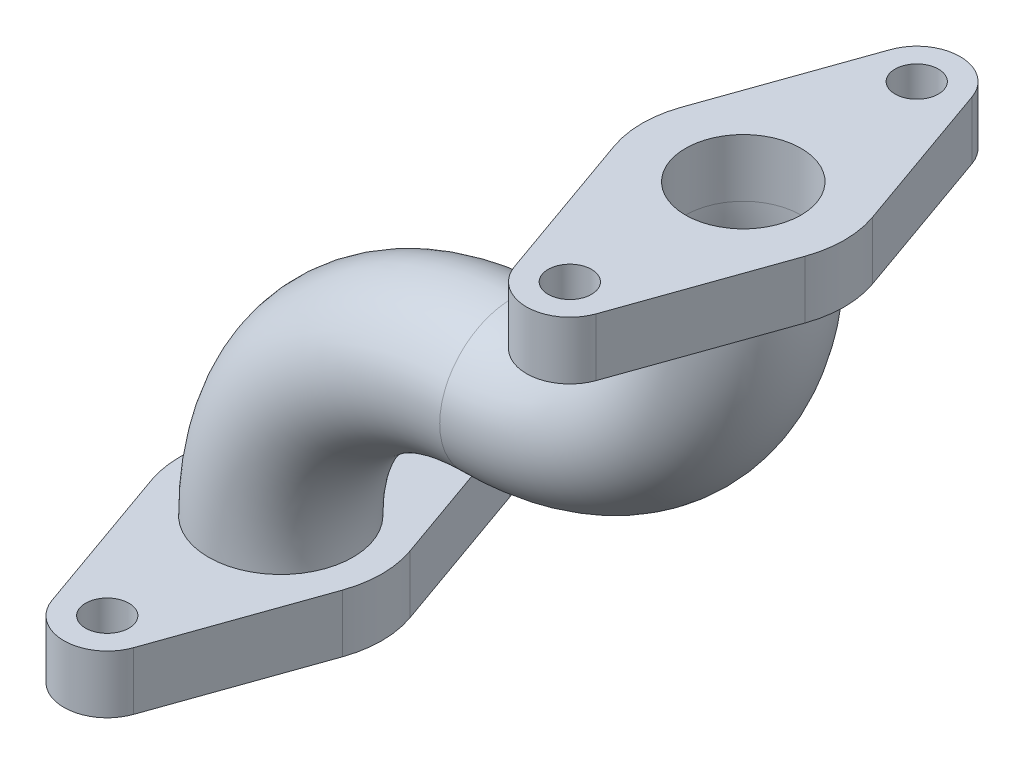
ISO-10303-21;
HEADER;
FILE_DESCRIPTION(('STEP AP214'),'2;1');
FILE_NAME('part.step','',(''),(''),'','','');
FILE_SCHEMA(('AUTOMOTIVE_DESIGN { 1 0 10303 214 1 1 1 1 }'));
ENDSEC;
DATA;
#1=APPLICATION_CONTEXT('core data for automotive mechanical design processes');
#2=APPLICATION_PROTOCOL_DEFINITION('international standard','automotive_design',2000,#1);
#3=PRODUCT_CONTEXT('',#1,'mechanical');
#4=PRODUCT('Part','Part','',(#3));
#5=PRODUCT_RELATED_PRODUCT_CATEGORY('part','',(#4));
#6=PRODUCT_DEFINITION_FORMATION('','',#4);
#7=PRODUCT_DEFINITION_CONTEXT('part definition',#1,'design');
#8=PRODUCT_DEFINITION('design','',#6,#7);
#9=PRODUCT_DEFINITION_SHAPE('','',#8);
#10=(LENGTH_UNIT() NAMED_UNIT(*) SI_UNIT(.MILLI.,.METRE.));
#11=(NAMED_UNIT(*) PLANE_ANGLE_UNIT() SI_UNIT($,.RADIAN.));
#12=(NAMED_UNIT(*) SI_UNIT($,.STERADIAN.) SOLID_ANGLE_UNIT());
#13=UNCERTAINTY_MEASURE_WITH_UNIT(LENGTH_MEASURE(1.E-05),#10,'distance_accuracy_value','');
#14=(GEOMETRIC_REPRESENTATION_CONTEXT(3) GLOBAL_UNCERTAINTY_ASSIGNED_CONTEXT((#13)) GLOBAL_UNIT_ASSIGNED_CONTEXT((#10,
#11,#12)) REPRESENTATION_CONTEXT('',''));
#15=CARTESIAN_POINT('',(0.,0.,0.));
#16=DIRECTION('',(0.,0.,1.));
#17=DIRECTION('',(1.,0.,0.));
#18=AXIS2_PLACEMENT_3D('',#15,#16,#17);
#19=CARTESIAN_POINT('',(69.3571801619498,114.3,24.5214662082459));
#20=DIRECTION('',(-0.942809041582063,0.,-0.333333333333333));
#21=DIRECTION('',(-0.333333333333333,0.,0.942809041582064));
#22=AXIS2_PLACEMENT_3D('',#19,#20,#21);
#23=PLANE('',#22);
#24=DIRECTION('',(0.333333333333333,0.,-0.942809041582063));
#25=VECTOR('',#24,1.);
#26=CARTESIAN_POINT('',(69.3571801619498,101.6,24.5214662082459));
#27=LINE('',#26,#25);
#28=CARTESIAN_POINT('',(80.6460690508386,101.6,-7.40833333333333));
#29=VERTEX_POINT('',#28);
#30=CARTESIAN_POINT('',(92.6197438789308,101.6,-41.275));
#31=VERTEX_POINT('',#30);
#32=EDGE_CURVE('E183',#29,#31,#27,.T.);
#33=ORIENTED_EDGE('',*,*,#32,.F.);
#34=DIRECTION('',(0.,-1.,0.));
#35=VECTOR('',#34,1.);
#36=CARTESIAN_POINT('',(80.6460690508386,114.3,-7.40833333333333));
#37=LINE('',#36,#35);
#38=CARTESIAN_POINT('',(80.6460690508386,114.3,-7.40833333333333));
#39=VERTEX_POINT('',#38);
#40=EDGE_CURVE('E12',#39,#29,#37,.T.);
#41=ORIENTED_EDGE('',*,*,#40,.F.);
#42=DIRECTION('',(0.333333333333333,0.,-0.942809041582063));
#43=VECTOR('',#42,1.);
#44=CARTESIAN_POINT('',(69.3571801619498,114.3,24.5214662082459));
#45=LINE('',#44,#43);
#46=CARTESIAN_POINT('',(92.6197438789308,114.3,-41.275));
#47=VERTEX_POINT('',#46);
#48=EDGE_CURVE('E578',#39,#47,#45,.T.);
#49=ORIENTED_EDGE('',*,*,#48,.T.);
#50=DIRECTION('',(0.,-1.,0.));
#51=VECTOR('',#50,1.);
#52=CARTESIAN_POINT('',(92.6197438789308,114.3,-41.275));
#53=LINE('',#52,#51);
#54=EDGE_CURVE('E106',#47,#31,#53,.T.);
#55=ORIENTED_EDGE('',*,*,#54,.T.);
#56=EDGE_LOOP('',(#33,#41,#49,#55));
#57=FACE_BOUND('',#56,.T.);
#58=ADVANCED_FACE('F53',(#57),#23,.T.);
#59=CARTESIAN_POINT('',(101.6,114.3,0.));
#60=DIRECTION('',(0.,-1.,0.));
#61=DIRECTION('',(0.,0.,-1.));
#62=AXIS2_PLACEMENT_3D('',#59,#60,#61);
#63=CYLINDRICAL_SURFACE('',#62,22.225);
#64=CARTESIAN_POINT('',(101.6,101.6,0.));
#65=DIRECTION('',(0.,1.,0.));
#66=DIRECTION('',(0.,0.,1.));
#67=AXIS2_PLACEMENT_3D('',#64,#65,#66);
#68=CIRCLE('',#67,22.225);
#69=CARTESIAN_POINT('',(80.6460690508386,101.6,7.40833333333333));
#70=VERTEX_POINT('',#69);
#71=EDGE_CURVE('E180',#29,#70,#68,.T.);
#72=ORIENTED_EDGE('',*,*,#71,.T.);
#73=DIRECTION('',(0.,-1.,0.));
#74=VECTOR('',#73,1.);
#75=CARTESIAN_POINT('',(80.6460690508386,114.3,7.40833333333333));
#76=LINE('',#75,#74);
#77=CARTESIAN_POINT('',(80.6460690508386,114.3,7.40833333333333));
#78=VERTEX_POINT('',#77);
#79=EDGE_CURVE('E63',#78,#70,#76,.T.);
#80=ORIENTED_EDGE('',*,*,#79,.F.);
#81=CARTESIAN_POINT('',(101.6,114.3,0.));
#82=DIRECTION('',(0.,1.,0.));
#83=DIRECTION('',(0.,0.,1.));
#84=AXIS2_PLACEMENT_3D('',#81,#82,#83);
#85=CIRCLE('',#84,22.225);
#86=EDGE_CURVE('E581',#39,#78,#85,.T.);
#87=ORIENTED_EDGE('',*,*,#86,.F.);
#88=ORIENTED_EDGE('',*,*,#40,.T.);
#89=EDGE_LOOP('',(#72,#80,#87,#88));
#90=FACE_BOUND('',#89,.T.);
#91=ADVANCED_FACE('F181',(#90),#63,.T.);
#92=CARTESIAN_POINT('',(69.3571801619498,114.3,-24.5214662082459));
#93=DIRECTION('',(-0.942809041582063,0.,0.333333333333333));
#94=DIRECTION('',(0.333333333333333,0.,0.942809041582063));
#95=AXIS2_PLACEMENT_3D('',#92,#93,#94);
#96=PLANE('',#95);
#97=DIRECTION('',(-0.333333333333333,0.,-0.942809041582063));
#98=VECTOR('',#97,1.);
#99=CARTESIAN_POINT('',(69.3571801619498,101.6,-24.5214662082459));
#100=LINE('',#99,#98);
#101=CARTESIAN_POINT('',(92.6197438789308,101.6,41.275));
#102=VERTEX_POINT('',#101);
#103=EDGE_CURVE('E175',#102,#70,#100,.T.);
#104=ORIENTED_EDGE('',*,*,#103,.F.);
#105=DIRECTION('',(0.,-1.,0.));
#106=VECTOR('',#105,1.);
#107=CARTESIAN_POINT('',(92.6197438789308,114.3,41.275));
#108=LINE('',#107,#106);
#109=CARTESIAN_POINT('',(92.6197438789308,114.3,41.275));
#110=VERTEX_POINT('',#109);
#111=EDGE_CURVE('E165',#110,#102,#108,.T.);
#112=ORIENTED_EDGE('',*,*,#111,.F.);
#113=DIRECTION('',(-0.333333333333333,0.,-0.942809041582063));
#114=VECTOR('',#113,1.);
#115=CARTESIAN_POINT('',(69.3571801619498,114.3,-24.5214662082459));
#116=LINE('',#115,#114);
#117=EDGE_CURVE('E177',#110,#78,#116,.T.);
#118=ORIENTED_EDGE('',*,*,#117,.T.);
#119=ORIENTED_EDGE('',*,*,#79,.T.);
#120=EDGE_LOOP('',(#104,#112,#118,#119));
#121=FACE_BOUND('',#120,.T.);
#122=ADVANCED_FACE('F173',(#121),#96,.T.);
#123=CARTESIAN_POINT('',(101.6,114.3,38.1));
#124=DIRECTION('',(0.,-1.,0.));
#125=DIRECTION('',(0.,0.,-1.));
#126=AXIS2_PLACEMENT_3D('',#123,#124,#125);
#127=CYLINDRICAL_SURFACE('',#126,9.52499999999999);
#128=CARTESIAN_POINT('',(101.6,101.6,38.1));
#129=DIRECTION('',(0.,1.,0.));
#130=DIRECTION('',(0.,0.,1.));
#131=AXIS2_PLACEMENT_3D('',#128,#129,#130);
#132=CIRCLE('',#131,9.52499999999999);
#133=CARTESIAN_POINT('',(110.580256121069,101.6,41.275));
#134=VERTEX_POINT('',#133);
#135=EDGE_CURVE('E188',#102,#134,#132,.T.);
#136=ORIENTED_EDGE('',*,*,#135,.T.);
#137=DIRECTION('',(0.,-1.,0.));
#138=VECTOR('',#137,1.);
#139=CARTESIAN_POINT('',(110.580256121069,114.3,41.275));
#140=LINE('',#139,#138);
#141=CARTESIAN_POINT('',(110.580256121069,114.3,41.275));
#142=VERTEX_POINT('',#141);
#143=EDGE_CURVE('E157',#142,#134,#140,.T.);
#144=ORIENTED_EDGE('',*,*,#143,.F.);
#145=CARTESIAN_POINT('',(101.6,114.3,38.1));
#146=DIRECTION('',(0.,1.,0.));
#147=DIRECTION('',(0.,0.,1.));
#148=AXIS2_PLACEMENT_3D('',#145,#146,#147);
#149=CIRCLE('',#148,9.52499999999999);
#150=EDGE_CURVE('E586',#110,#142,#149,.T.);
#151=ORIENTED_EDGE('',*,*,#150,.F.);
#152=ORIENTED_EDGE('',*,*,#111,.T.);
#153=EDGE_LOOP('',(#136,#144,#151,#152));
#154=FACE_BOUND('',#153,.T.);
#155=ADVANCED_FACE('F279',(#154),#127,.T.);
#156=CARTESIAN_POINT('',(111.265042060272,114.3,39.3381328749126));
#157=DIRECTION('',(-0.942809041582063,0.,-0.333333333333333));
#158=DIRECTION('',(-0.333333333333333,0.,0.942809041582063));
#159=AXIS2_PLACEMENT_3D('',#156,#157,#158);
#160=PLANE('',#159);
#161=DIRECTION('',(0.333333333333333,0.,-0.942809041582063));
#162=VECTOR('',#161,1.);
#163=CARTESIAN_POINT('',(111.265042060272,101.6,39.3381328749126));
#164=LINE('',#163,#162);
#165=CARTESIAN_POINT('',(122.553930949161,101.6,7.40833333333333));
#166=VERTEX_POINT('',#165);
#167=EDGE_CURVE('E192',#134,#166,#164,.T.);
#168=ORIENTED_EDGE('',*,*,#167,.T.);
#169=DIRECTION('',(0.,-1.,0.));
#170=VECTOR('',#169,1.);
#171=CARTESIAN_POINT('',(122.553930949161,114.3,7.40833333333333));
#172=LINE('',#171,#170);
#173=CARTESIAN_POINT('',(122.553930949161,114.3,7.40833333333333));
#174=VERTEX_POINT('',#173);
#175=EDGE_CURVE('E153',#174,#166,#172,.T.);
#176=ORIENTED_EDGE('',*,*,#175,.F.);
#177=DIRECTION('',(0.333333333333333,0.,-0.942809041582063));
#178=VECTOR('',#177,1.);
#179=CARTESIAN_POINT('',(111.265042060272,114.3,39.3381328749126));
#180=LINE('',#179,#178);
#181=EDGE_CURVE('E144',#142,#174,#180,.T.);
#182=ORIENTED_EDGE('',*,*,#181,.F.);
#183=ORIENTED_EDGE('',*,*,#143,.T.);
#184=EDGE_LOOP('',(#168,#176,#182,#183));
#185=FACE_BOUND('',#184,.T.);
#186=ADVANCED_FACE('F276',(#185),#160,.F.);
#187=CARTESIAN_POINT('',(101.6,114.3,0.));
#188=DIRECTION('',(0.,-1.,0.));
#189=DIRECTION('',(0.,0.,-1.));
#190=AXIS2_PLACEMENT_3D('',#187,#188,#189);
#191=CYLINDRICAL_SURFACE('',#190,22.225);
#192=CARTESIAN_POINT('',(101.6,101.6,0.));
#193=DIRECTION('',(0.,1.,0.));
#194=DIRECTION('',(0.,0.,1.));
#195=AXIS2_PLACEMENT_3D('',#192,#193,#194);
#196=CIRCLE('',#195,22.225);
#197=CARTESIAN_POINT('',(122.553930949161,101.6,-7.40833333333333));
#198=VERTEX_POINT('',#197);
#199=EDGE_CURVE('E151',#166,#198,#196,.T.);
#200=ORIENTED_EDGE('',*,*,#199,.T.);
#201=DIRECTION('',(0.,-1.,0.));
#202=VECTOR('',#201,1.);
#203=CARTESIAN_POINT('',(122.553930949161,114.3,-7.40833333333333));
#204=LINE('',#203,#202);
#205=CARTESIAN_POINT('',(122.553930949161,114.3,-7.40833333333333));
#206=VERTEX_POINT('',#205);
#207=EDGE_CURVE('E134',#206,#198,#204,.T.);
#208=ORIENTED_EDGE('',*,*,#207,.F.);
#209=CARTESIAN_POINT('',(101.6,114.3,0.));
#210=DIRECTION('',(0.,1.,0.));
#211=DIRECTION('',(0.,0.,1.));
#212=AXIS2_PLACEMENT_3D('',#209,#210,#211);
#213=CIRCLE('',#212,22.225);
#214=EDGE_CURVE('E138',#174,#206,#213,.T.);
#215=ORIENTED_EDGE('',*,*,#214,.F.);
#216=ORIENTED_EDGE('',*,*,#175,.T.);
#217=EDGE_LOOP('',(#200,#208,#215,#216));
#218=FACE_BOUND('',#217,.T.);
#219=ADVANCED_FACE('F150',(#218),#191,.T.);
#220=CARTESIAN_POINT('',(111.265042060272,114.3,-39.3381328749125));
#221=DIRECTION('',(-0.942809041582063,0.,0.333333333333333));
#222=DIRECTION('',(0.333333333333333,0.,0.942809041582064));
#223=AXIS2_PLACEMENT_3D('',#220,#221,#222);
#224=PLANE('',#223);
#225=DIRECTION('',(-0.333333333333333,0.,-0.942809041582063));
#226=VECTOR('',#225,1.);
#227=CARTESIAN_POINT('',(111.265042060272,101.6,-39.3381328749125));
#228=LINE('',#227,#226);
#229=CARTESIAN_POINT('',(110.580256121069,101.6,-41.275));
#230=VERTEX_POINT('',#229);
#231=EDGE_CURVE('E201',#198,#230,#228,.T.);
#232=ORIENTED_EDGE('',*,*,#231,.T.);
#233=DIRECTION('',(0.,-1.,0.));
#234=VECTOR('',#233,1.);
#235=CARTESIAN_POINT('',(110.580256121069,114.3,-41.275));
#236=LINE('',#235,#234);
#237=CARTESIAN_POINT('',(110.580256121069,114.3,-41.275));
#238=VERTEX_POINT('',#237);
#239=EDGE_CURVE('E136',#238,#230,#236,.T.);
#240=ORIENTED_EDGE('',*,*,#239,.F.);
#241=DIRECTION('',(-0.333333333333333,0.,-0.942809041582063));
#242=VECTOR('',#241,1.);
#243=CARTESIAN_POINT('',(111.265042060272,114.3,-39.3381328749125));
#244=LINE('',#243,#242);
#245=EDGE_CURVE('E129',#206,#238,#244,.T.);
#246=ORIENTED_EDGE('',*,*,#245,.F.);
#247=ORIENTED_EDGE('',*,*,#207,.T.);
#248=EDGE_LOOP('',(#232,#240,#246,#247));
#249=FACE_BOUND('',#248,.T.);
#250=ADVANCED_FACE('F132',(#249),#224,.F.);
#251=CARTESIAN_POINT('',(101.6,114.3,-38.1));
#252=DIRECTION('',(0.,-1.,0.));
#253=DIRECTION('',(0.,0.,-1.));
#254=AXIS2_PLACEMENT_3D('',#251,#252,#253);
#255=CYLINDRICAL_SURFACE('',#254,9.52500000000001);
#256=CARTESIAN_POINT('',(101.6,101.6,-38.1));
#257=DIRECTION('',(0.,1.,0.));
#258=DIRECTION('',(0.,0.,1.));
#259=AXIS2_PLACEMENT_3D('',#256,#257,#258);
#260=CIRCLE('',#259,9.52500000000001);
#261=EDGE_CURVE('E99',#230,#31,#260,.T.);
#262=ORIENTED_EDGE('',*,*,#261,.T.);
#263=ORIENTED_EDGE('',*,*,#54,.F.);
#264=CARTESIAN_POINT('',(101.6,114.3,-38.1));
#265=DIRECTION('',(0.,1.,0.));
#266=DIRECTION('',(0.,0.,1.));
#267=AXIS2_PLACEMENT_3D('',#264,#265,#266);
#268=CIRCLE('',#267,9.52500000000001);
#269=EDGE_CURVE('E71',#238,#47,#268,.T.);
#270=ORIENTED_EDGE('',*,*,#269,.F.);
#271=ORIENTED_EDGE('',*,*,#239,.T.);
#272=EDGE_LOOP('',(#262,#263,#270,#271));
#273=FACE_BOUND('',#272,.T.);
#274=ADVANCED_FACE('F238',(#273),#255,.T.);
#275=CARTESIAN_POINT('',(101.6,114.3,38.1));
#276=DIRECTION('',(0.,-1.,0.));
#277=DIRECTION('',(0.,0.,-1.));
#278=AXIS2_PLACEMENT_3D('',#275,#276,#277);
#279=CYLINDRICAL_SURFACE('',#278,4.7625);
#280=CARTESIAN_POINT('',(101.6,114.3,38.1));
#281=DIRECTION('',(0.,1.,0.));
#282=DIRECTION('',(0.,0.,1.));
#283=AXIS2_PLACEMENT_3D('',#280,#281,#282);
#284=CIRCLE('',#283,4.7625);
#285=CARTESIAN_POINT('',(101.6,114.3,42.8625));
#286=VERTEX_POINT('',#285);
#287=EDGE_CURVE('E251',#286,#286,#284,.T.);
#288=ORIENTED_EDGE('',*,*,#287,.T.);
#289=EDGE_LOOP('',(#288));
#290=FACE_BOUND('',#289,.T.);
#291=CARTESIAN_POINT('',(101.6,101.6,38.1));
#292=DIRECTION('',(0.,1.,0.));
#293=DIRECTION('',(0.,0.,1.));
#294=AXIS2_PLACEMENT_3D('',#291,#292,#293);
#295=CIRCLE('',#294,4.7625);
#296=CARTESIAN_POINT('',(101.6,101.6,42.8625));
#297=VERTEX_POINT('',#296);
#298=EDGE_CURVE('E224',#297,#297,#295,.T.);
#299=ORIENTED_EDGE('',*,*,#298,.F.);
#300=EDGE_LOOP('',(#299));
#301=FACE_BOUND('',#300,.T.);
#302=ADVANCED_FACE('F236',(#290,#301),#279,.F.);
#303=CARTESIAN_POINT('',(101.6,114.3,-38.1));
#304=DIRECTION('',(0.,-1.,0.));
#305=DIRECTION('',(0.,0.,-1.));
#306=AXIS2_PLACEMENT_3D('',#303,#304,#305);
#307=CYLINDRICAL_SURFACE('',#306,4.7625);
#308=CARTESIAN_POINT('',(101.6,114.3,-38.1));
#309=DIRECTION('',(0.,1.,0.));
#310=DIRECTION('',(0.,0.,1.));
#311=AXIS2_PLACEMENT_3D('',#308,#309,#310);
#312=CIRCLE('',#311,4.7625);
#313=CARTESIAN_POINT('',(101.6,114.3,-33.3375));
#314=VERTEX_POINT('',#313);
#315=EDGE_CURVE('E209',#314,#314,#312,.T.);
#316=ORIENTED_EDGE('',*,*,#315,.T.);
#317=EDGE_LOOP('',(#316));
#318=FACE_BOUND('',#317,.T.);
#319=CARTESIAN_POINT('',(101.6,101.6,-38.1));
#320=DIRECTION('',(0.,1.,0.));
#321=DIRECTION('',(0.,0.,1.));
#322=AXIS2_PLACEMENT_3D('',#319,#320,#321);
#323=CIRCLE('',#322,4.7625);
#324=CARTESIAN_POINT('',(101.6,101.6,-33.3375));
#325=VERTEX_POINT('',#324);
#326=EDGE_CURVE('E220',#325,#325,#323,.T.);
#327=ORIENTED_EDGE('',*,*,#326,.F.);
#328=EDGE_LOOP('',(#327));
#329=FACE_BOUND('',#328,.T.);
#330=ADVANCED_FACE('F55',(#318,#329),#307,.F.);
#331=CARTESIAN_POINT('',(101.6,114.3,0.));
#332=DIRECTION('',(0.,-1.,0.));
#333=DIRECTION('',(0.,0.,-1.));
#334=AXIS2_PLACEMENT_3D('',#331,#332,#333);
#335=CYLINDRICAL_SURFACE('',#334,12.7);
#336=CARTESIAN_POINT('',(101.6,114.3,0.));
#337=DIRECTION('',(0.,1.,0.));
#338=DIRECTION('',(0.,0.,1.));
#339=AXIS2_PLACEMENT_3D('',#336,#337,#338);
#340=CIRCLE('',#339,12.7);
#341=CARTESIAN_POINT('',(101.6,114.3,12.7));
#342=VERTEX_POINT('',#341);
#343=EDGE_CURVE('E211',#342,#342,#340,.T.);
#344=ORIENTED_EDGE('',*,*,#343,.T.);
#345=EDGE_LOOP('',(#344));
#346=FACE_BOUND('',#345,.T.);
#347=CARTESIAN_POINT('',(101.6,101.6,0.));
#348=DIRECTION('',(0.,1.,0.));
#349=DIRECTION('',(0.,0.,1.));
#350=AXIS2_PLACEMENT_3D('',#347,#348,#349);
#351=CIRCLE('',#350,12.7);
#352=CARTESIAN_POINT('',(114.3,101.6,0.));
#353=VERTEX_POINT('',#352);
#354=EDGE_CURVE('E206',#353,#353,#351,.T.);
#355=ORIENTED_EDGE('',*,*,#354,.F.);
#356=EDGE_LOOP('',(#355));
#357=FACE_BOUND('',#356,.T.);
#358=ADVANCED_FACE('F244',(#346,#357),#335,.F.);
#359=CARTESIAN_POINT('',(0.,114.3,0.));
#360=DIRECTION('',(0.,1.,0.));
#361=DIRECTION('',(0.,0.,1.));
#362=AXIS2_PLACEMENT_3D('',#359,#360,#361);
#363=PLANE('',#362);
#364=ORIENTED_EDGE('',*,*,#315,.F.);
#365=EDGE_LOOP('',(#364));
#366=FACE_BOUND('',#365,.T.);
#367=ORIENTED_EDGE('',*,*,#287,.F.);
#368=EDGE_LOOP('',(#367));
#369=FACE_BOUND('',#368,.T.);
#370=ORIENTED_EDGE('',*,*,#48,.F.);
#371=ORIENTED_EDGE('',*,*,#86,.T.);
#372=ORIENTED_EDGE('',*,*,#117,.F.);
#373=ORIENTED_EDGE('',*,*,#150,.T.);
#374=ORIENTED_EDGE('',*,*,#181,.T.);
#375=ORIENTED_EDGE('',*,*,#214,.T.);
#376=ORIENTED_EDGE('',*,*,#245,.T.);
#377=ORIENTED_EDGE('',*,*,#269,.T.);
#378=EDGE_LOOP('',(#370,#371,#372,#373,#374,#375,#376,#377));
#379=FACE_BOUND('',#378,.T.);
#380=ORIENTED_EDGE('',*,*,#343,.F.);
#381=EDGE_LOOP('',(#380));
#382=FACE_BOUND('',#381,.T.);
#383=ADVANCED_FACE('F141',(#366,#369,#379,#382),#363,.T.);
#384=CARTESIAN_POINT('',(0.,101.6,0.));
#385=DIRECTION('',(0.,1.,0.));
#386=DIRECTION('',(0.,0.,1.));
#387=AXIS2_PLACEMENT_3D('',#384,#385,#386);
#388=PLANE('',#387);
#389=CARTESIAN_POINT('',(101.6,101.6,0.));
#390=DIRECTION('',(0.,-1.,0.));
#391=DIRECTION('',(1.,0.,0.));
#392=AXIS2_PLACEMENT_3D('',#389,#390,#391);
#393=CIRCLE('',#392,15.875);
#394=CARTESIAN_POINT('',(117.475,101.6,0.));
#395=VERTEX_POINT('',#394);
#396=EDGE_CURVE('E566',#395,#395,#393,.T.);
#397=ORIENTED_EDGE('',*,*,#396,.F.);
#398=EDGE_LOOP('',(#397));
#399=FACE_BOUND('',#398,.T.);
#400=ORIENTED_EDGE('',*,*,#326,.T.);
#401=EDGE_LOOP('',(#400));
#402=FACE_BOUND('',#401,.T.);
#403=ORIENTED_EDGE('',*,*,#298,.T.);
#404=EDGE_LOOP('',(#403));
#405=FACE_BOUND('',#404,.T.);
#406=ORIENTED_EDGE('',*,*,#32,.T.);
#407=ORIENTED_EDGE('',*,*,#261,.F.);
#408=ORIENTED_EDGE('',*,*,#231,.F.);
#409=ORIENTED_EDGE('',*,*,#199,.F.);
#410=ORIENTED_EDGE('',*,*,#167,.F.);
#411=ORIENTED_EDGE('',*,*,#135,.F.);
#412=ORIENTED_EDGE('',*,*,#103,.T.);
#413=ORIENTED_EDGE('',*,*,#71,.F.);
#414=EDGE_LOOP('',(#406,#407,#408,#409,#410,#411,#412,#413));
#415=FACE_BOUND('',#414,.T.);
#416=ADVANCED_FACE('F186',(#399,#402,#405,#415),#388,.F.);
#417=CARTESIAN_POINT('',(50.7999999999997,101.6,0.));
#418=DIRECTION('',(0.,0.,-1.));
#419=DIRECTION('',(-1.,0.,0.));
#420=AXIS2_PLACEMENT_3D('',#417,#418,#419);
#421=TOROIDAL_SURFACE('',#420,50.8000000000003,15.875);
#422=CARTESIAN_POINT('',(50.8,50.8,0.));
#423=DIRECTION('',(-1.,0.,0.));
#424=DIRECTION('',(0.,-1.,0.));
#425=AXIS2_PLACEMENT_3D('',#422,#423,#424);
#426=CIRCLE('',#425,15.875);
#427=CARTESIAN_POINT('',(50.8000000000001,34.925,0.));
#428=VERTEX_POINT('',#427);
#429=EDGE_CURVE('E225',#428,#428,#426,.T.);
#430=CARTESIAN_POINT('',(50.7999999999997,101.6,0.));
#431=DIRECTION('',(0.,0.,-1.));
#432=DIRECTION('',(-1.,0.,0.));
#433=AXIS2_PLACEMENT_3D('',#430,#431,#432);
#434=CIRCLE('',#433,66.6750000000003);
#435=EDGE_CURVE('',#395,#428,#434,.T.);
#436=ORIENTED_EDGE('',*,*,#396,.T.);
#437=ORIENTED_EDGE('',*,*,#429,.F.);
#438=ORIENTED_EDGE('',*,*,#435,.T.);
#439=ORIENTED_EDGE('',*,*,#435,.F.);
#440=EDGE_LOOP('',(#436,#438,#437,#439));
#441=FACE_BOUND('',#440,.T.);
#442=ADVANCED_FACE('F255',(#441),#421,.T.);
#443=CARTESIAN_POINT('',(50.7999999999997,101.6,0.));
#444=DIRECTION('',(0.,0.,-1.));
#445=DIRECTION('',(-1.,0.,0.));
#446=AXIS2_PLACEMENT_3D('',#443,#444,#445);
#447=TOROIDAL_SURFACE('',#446,50.8000000000003,12.7);
#448=CARTESIAN_POINT('',(50.8,50.8,0.));
#449=DIRECTION('',(1.,0.,0.));
#450=DIRECTION('',(0.,1.,0.));
#451=AXIS2_PLACEMENT_3D('',#448,#449,#450);
#452=CIRCLE('',#451,12.7);
#453=CARTESIAN_POINT('',(50.8000000000001,38.1,0.));
#454=VERTEX_POINT('',#453);
#455=EDGE_CURVE('E510',#454,#454,#452,.T.);
#456=CARTESIAN_POINT('',(50.7999999999997,101.6,0.));
#457=DIRECTION('',(0.,0.,-1.));
#458=DIRECTION('',(-1.,0.,0.));
#459=AXIS2_PLACEMENT_3D('',#456,#457,#458);
#460=CIRCLE('',#459,63.5000000000003);
#461=EDGE_CURVE('',#353,#454,#460,.T.);
#462=ORIENTED_EDGE('',*,*,#354,.T.);
#463=ORIENTED_EDGE('',*,*,#455,.F.);
#464=ORIENTED_EDGE('',*,*,#461,.T.);
#465=ORIENTED_EDGE('',*,*,#461,.F.);
#466=EDGE_LOOP('',(#462,#464,#463,#465));
#467=FACE_BOUND('',#466,.T.);
#468=ADVANCED_FACE('F262',(#467),#447,.F.);
#469=CARTESIAN_POINT('',(-20.9539309491614,-12.7,-7.40833333333333));
#470=DIRECTION('',(0.942809041582063,0.,0.333333333333333));
#471=DIRECTION('',(0.333333333333333,0.,-0.942809041582063));
#472=AXIS2_PLACEMENT_3D('',#469,#470,#471);
#473=PLANE('',#472);
#474=DIRECTION('',(0.333333333333333,0.,-0.942809041582063));
#475=VECTOR('',#474,1.);
#476=CARTESIAN_POINT('',(-20.9539309491614,0.,-7.40833333333333));
#477=LINE('',#476,#475);
#478=CARTESIAN_POINT('',(-20.9539309491614,0.,-7.40833333333333));
#479=VERTEX_POINT('',#478);
#480=CARTESIAN_POINT('',(-8.98025612106914,0.,-41.275));
#481=VERTEX_POINT('',#480);
#482=EDGE_CURVE('E613',#479,#481,#477,.T.);
#483=ORIENTED_EDGE('',*,*,#482,.T.);
#484=DIRECTION('',(0.,1.,0.));
#485=VECTOR('',#484,1.);
#486=CARTESIAN_POINT('',(-8.98025612106914,-12.7,-41.275));
#487=LINE('',#486,#485);
#488=CARTESIAN_POINT('',(-8.98025612106914,-12.7,-41.275));
#489=VERTEX_POINT('',#488);
#490=EDGE_CURVE('E529',#489,#481,#487,.T.);
#491=ORIENTED_EDGE('',*,*,#490,.F.);
#492=DIRECTION('',(0.333333333333333,0.,-0.942809041582063));
#493=VECTOR('',#492,1.);
#494=CARTESIAN_POINT('',(-20.9539309491614,-12.7,-7.40833333333333));
#495=LINE('',#494,#493);
#496=CARTESIAN_POINT('',(-20.9539309491614,-12.7,-7.40833333333333));
#497=VERTEX_POINT('',#496);
#498=EDGE_CURVE('E661',#497,#489,#495,.T.);
#499=ORIENTED_EDGE('',*,*,#498,.F.);
#500=DIRECTION('',(0.,1.,0.));
#501=VECTOR('',#500,1.);
#502=CARTESIAN_POINT('',(-20.9539309491614,-12.7,-7.40833333333333));
#503=LINE('',#502,#501);
#504=EDGE_CURVE('E558',#497,#479,#503,.T.);
#505=ORIENTED_EDGE('',*,*,#504,.T.);
#506=EDGE_LOOP('',(#483,#491,#499,#505));
#507=FACE_BOUND('',#506,.T.);
#508=ADVANCED_FACE('F353',(#507),#473,.F.);
#509=CARTESIAN_POINT('',(0.,-12.7,-38.1));
#510=DIRECTION('',(0.,1.,0.));
#511=DIRECTION('',(0.,0.,1.));
#512=AXIS2_PLACEMENT_3D('',#509,#510,#511);
#513=CYLINDRICAL_SURFACE('',#512,9.525);
#514=CARTESIAN_POINT('',(0.,0.,-38.1));
#515=DIRECTION('',(0.,1.,0.));
#516=DIRECTION('',(0.,0.,1.));
#517=AXIS2_PLACEMENT_3D('',#514,#515,#516);
#518=CIRCLE('',#517,9.525);
#519=CARTESIAN_POINT('',(8.98025612106916,0.,-41.275));
#520=VERTEX_POINT('',#519);
#521=EDGE_CURVE('E517',#520,#481,#518,.T.);
#522=ORIENTED_EDGE('',*,*,#521,.F.);
#523=DIRECTION('',(0.,1.,0.));
#524=VECTOR('',#523,1.);
#525=CARTESIAN_POINT('',(8.98025612106916,-12.7,-41.275));
#526=LINE('',#525,#524);
#527=CARTESIAN_POINT('',(8.98025612106916,-12.7,-41.275));
#528=VERTEX_POINT('',#527);
#529=EDGE_CURVE('E534',#528,#520,#526,.T.);
#530=ORIENTED_EDGE('',*,*,#529,.F.);
#531=CARTESIAN_POINT('',(0.,-12.7,-38.1));
#532=DIRECTION('',(0.,1.,0.));
#533=DIRECTION('',(0.,0.,1.));
#534=AXIS2_PLACEMENT_3D('',#531,#532,#533);
#535=CIRCLE('',#534,9.525);
#536=EDGE_CURVE('E659',#528,#489,#535,.T.);
#537=ORIENTED_EDGE('',*,*,#536,.T.);
#538=ORIENTED_EDGE('',*,*,#490,.T.);
#539=EDGE_LOOP('',(#522,#530,#537,#538));
#540=FACE_BOUND('',#539,.T.);
#541=ADVANCED_FACE('F362',(#540),#513,.T.);
#542=CARTESIAN_POINT('',(20.9539309491614,-12.7,-7.40833333333333));
#543=DIRECTION('',(0.942809041582063,0.,-0.333333333333333));
#544=DIRECTION('',(-0.333333333333333,0.,-0.942809041582064));
#545=AXIS2_PLACEMENT_3D('',#542,#543,#544);
#546=PLANE('',#545);
#547=DIRECTION('',(-0.333333333333333,0.,-0.942809041582063));
#548=VECTOR('',#547,1.);
#549=CARTESIAN_POINT('',(20.9539309491614,0.,-7.40833333333333));
#550=LINE('',#549,#548);
#551=CARTESIAN_POINT('',(20.9539309491614,0.,-7.40833333333333));
#552=VERTEX_POINT('',#551);
#553=EDGE_CURVE('E525',#552,#520,#550,.T.);
#554=ORIENTED_EDGE('',*,*,#553,.F.);
#555=DIRECTION('',(0.,1.,0.));
#556=VECTOR('',#555,1.);
#557=CARTESIAN_POINT('',(20.9539309491614,-12.7,-7.40833333333333));
#558=LINE('',#557,#556);
#559=CARTESIAN_POINT('',(20.9539309491614,-12.7,-7.40833333333333));
#560=VERTEX_POINT('',#559);
#561=EDGE_CURVE('E538',#560,#552,#558,.T.);
#562=ORIENTED_EDGE('',*,*,#561,.F.);
#563=DIRECTION('',(-0.333333333333333,0.,-0.942809041582063));
#564=VECTOR('',#563,1.);
#565=CARTESIAN_POINT('',(20.9539309491614,-12.7,-7.40833333333333));
#566=LINE('',#565,#564);
#567=EDGE_CURVE('E681',#560,#528,#566,.T.);
#568=ORIENTED_EDGE('',*,*,#567,.T.);
#569=ORIENTED_EDGE('',*,*,#529,.T.);
#570=EDGE_LOOP('',(#554,#562,#568,#569));
#571=FACE_BOUND('',#570,.T.);
#572=ADVANCED_FACE('F372',(#571),#546,.T.);
#573=CARTESIAN_POINT('',(0.,-12.7,0.));
#574=DIRECTION('',(0.,1.,0.));
#575=DIRECTION('',(0.,0.,1.));
#576=AXIS2_PLACEMENT_3D('',#573,#574,#575);
#577=CYLINDRICAL_SURFACE('',#576,22.225);
#578=CARTESIAN_POINT('',(0.,0.,0.));
#579=DIRECTION('',(0.,1.,0.));
#580=DIRECTION('',(0.,0.,1.));
#581=AXIS2_PLACEMENT_3D('',#578,#579,#580);
#582=CIRCLE('',#581,22.225);
#583=CARTESIAN_POINT('',(20.9539309491614,0.,7.40833333333333));
#584=VERTEX_POINT('',#583);
#585=EDGE_CURVE('E645',#584,#552,#582,.T.);
#586=ORIENTED_EDGE('',*,*,#585,.F.);
#587=DIRECTION('',(0.,1.,0.));
#588=VECTOR('',#587,1.);
#589=CARTESIAN_POINT('',(20.9539309491614,-12.7,7.40833333333333));
#590=LINE('',#589,#588);
#591=CARTESIAN_POINT('',(20.9539309491614,-12.7,7.40833333333333));
#592=VERTEX_POINT('',#591);
#593=EDGE_CURVE('E542',#592,#584,#590,.T.);
#594=ORIENTED_EDGE('',*,*,#593,.F.);
#595=CARTESIAN_POINT('',(0.,-12.7,0.));
#596=DIRECTION('',(0.,1.,0.));
#597=DIRECTION('',(0.,0.,1.));
#598=AXIS2_PLACEMENT_3D('',#595,#596,#597);
#599=CIRCLE('',#598,22.225);
#600=EDGE_CURVE('E679',#592,#560,#599,.T.);
#601=ORIENTED_EDGE('',*,*,#600,.T.);
#602=ORIENTED_EDGE('',*,*,#561,.T.);
#603=EDGE_LOOP('',(#586,#594,#601,#602));
#604=FACE_BOUND('',#603,.T.);
#605=ADVANCED_FACE('F382',(#604),#577,.T.);
#606=CARTESIAN_POINT('',(20.9539309491614,-12.7,7.40833333333333));
#607=DIRECTION('',(0.942809041582063,0.,0.333333333333333));
#608=DIRECTION('',(0.333333333333333,0.,-0.942809041582064));
#609=AXIS2_PLACEMENT_3D('',#606,#607,#608);
#610=PLANE('',#609);
#611=DIRECTION('',(0.333333333333333,0.,-0.942809041582063));
#612=VECTOR('',#611,1.);
#613=CARTESIAN_POINT('',(20.9539309491614,0.,7.40833333333333));
#614=LINE('',#613,#612);
#615=CARTESIAN_POINT('',(8.98025612106917,0.,41.275));
#616=VERTEX_POINT('',#615);
#617=EDGE_CURVE('E641',#616,#584,#614,.T.);
#618=ORIENTED_EDGE('',*,*,#617,.F.);
#619=DIRECTION('',(0.,1.,0.));
#620=VECTOR('',#619,1.);
#621=CARTESIAN_POINT('',(8.98025612106917,-12.7,41.275));
#622=LINE('',#621,#620);
#623=CARTESIAN_POINT('',(8.98025612106917,-12.7,41.275));
#624=VERTEX_POINT('',#623);
#625=EDGE_CURVE('E546',#624,#616,#622,.T.);
#626=ORIENTED_EDGE('',*,*,#625,.F.);
#627=DIRECTION('',(0.333333333333333,0.,-0.942809041582063));
#628=VECTOR('',#627,1.);
#629=CARTESIAN_POINT('',(20.9539309491614,-12.7,7.40833333333333));
#630=LINE('',#629,#628);
#631=EDGE_CURVE('E691',#624,#592,#630,.T.);
#632=ORIENTED_EDGE('',*,*,#631,.T.);
#633=ORIENTED_EDGE('',*,*,#593,.T.);
#634=EDGE_LOOP('',(#618,#626,#632,#633));
#635=FACE_BOUND('',#634,.T.);
#636=ADVANCED_FACE('F392',(#635),#610,.T.);
#637=CARTESIAN_POINT('',(0.,-12.7,38.1));
#638=DIRECTION('',(0.,1.,0.));
#639=DIRECTION('',(0.,0.,1.));
#640=AXIS2_PLACEMENT_3D('',#637,#638,#639);
#641=CYLINDRICAL_SURFACE('',#640,9.52500000000001);
#642=CARTESIAN_POINT('',(0.,0.,38.1));
#643=DIRECTION('',(0.,1.,0.));
#644=DIRECTION('',(0.,0.,1.));
#645=AXIS2_PLACEMENT_3D('',#642,#643,#644);
#646=CIRCLE('',#645,9.52500000000001);
#647=CARTESIAN_POINT('',(-8.98025612106916,0.,41.275));
#648=VERTEX_POINT('',#647);
#649=EDGE_CURVE('E634',#648,#616,#646,.T.);
#650=ORIENTED_EDGE('',*,*,#649,.F.);
#651=DIRECTION('',(0.,1.,0.));
#652=VECTOR('',#651,1.);
#653=CARTESIAN_POINT('',(-8.98025612106916,-12.7,41.275));
#654=LINE('',#653,#652);
#655=CARTESIAN_POINT('',(-8.98025612106916,-12.7,41.275));
#656=VERTEX_POINT('',#655);
#657=EDGE_CURVE('E550',#656,#648,#654,.T.);
#658=ORIENTED_EDGE('',*,*,#657,.F.);
#659=CARTESIAN_POINT('',(0.,-12.7,38.1));
#660=DIRECTION('',(0.,1.,0.));
#661=DIRECTION('',(0.,0.,1.));
#662=AXIS2_PLACEMENT_3D('',#659,#660,#661);
#663=CIRCLE('',#662,9.52500000000001);
#664=EDGE_CURVE('E716',#656,#624,#663,.T.);
#665=ORIENTED_EDGE('',*,*,#664,.T.);
#666=ORIENTED_EDGE('',*,*,#625,.T.);
#667=EDGE_LOOP('',(#650,#658,#665,#666));
#668=FACE_BOUND('',#667,.T.);
#669=ADVANCED_FACE('F402',(#668),#641,.T.);
#670=CARTESIAN_POINT('',(-20.9539309491614,-12.7,7.40833333333333));
#671=DIRECTION('',(0.942809041582063,0.,-0.333333333333333));
#672=DIRECTION('',(-0.333333333333333,0.,-0.942809041582064));
#673=AXIS2_PLACEMENT_3D('',#670,#671,#672);
#674=PLANE('',#673);
#675=DIRECTION('',(-0.333333333333333,0.,-0.942809041582063));
#676=VECTOR('',#675,1.);
#677=CARTESIAN_POINT('',(-20.9539309491614,0.,7.40833333333333));
#678=LINE('',#677,#676);
#679=CARTESIAN_POINT('',(-20.9539309491614,0.,7.40833333333333));
#680=VERTEX_POINT('',#679);
#681=EDGE_CURVE('E631',#648,#680,#678,.T.);
#682=ORIENTED_EDGE('',*,*,#681,.T.);
#683=DIRECTION('',(0.,1.,0.));
#684=VECTOR('',#683,1.);
#685=CARTESIAN_POINT('',(-20.9539309491614,-12.7,7.40833333333333));
#686=LINE('',#685,#684);
#687=CARTESIAN_POINT('',(-20.9539309491614,-12.7,7.40833333333333));
#688=VERTEX_POINT('',#687);
#689=EDGE_CURVE('E554',#688,#680,#686,.T.);
#690=ORIENTED_EDGE('',*,*,#689,.F.);
#691=DIRECTION('',(-0.333333333333333,0.,-0.942809041582063));
#692=VECTOR('',#691,1.);
#693=CARTESIAN_POINT('',(-20.9539309491614,-12.7,7.40833333333333));
#694=LINE('',#693,#692);
#695=EDGE_CURVE('E712',#656,#688,#694,.T.);
#696=ORIENTED_EDGE('',*,*,#695,.F.);
#697=ORIENTED_EDGE('',*,*,#657,.T.);
#698=EDGE_LOOP('',(#682,#690,#696,#697));
#699=FACE_BOUND('',#698,.T.);
#700=ADVANCED_FACE('F412',(#699),#674,.F.);
#701=CARTESIAN_POINT('',(0.,-12.7,0.));
#702=DIRECTION('',(0.,1.,0.));
#703=DIRECTION('',(0.,0.,1.));
#704=AXIS2_PLACEMENT_3D('',#701,#702,#703);
#705=CYLINDRICAL_SURFACE('',#704,22.225);
#706=CARTESIAN_POINT('',(0.,0.,0.));
#707=DIRECTION('',(0.,1.,0.));
#708=DIRECTION('',(0.,0.,1.));
#709=AXIS2_PLACEMENT_3D('',#706,#707,#708);
#710=CIRCLE('',#709,22.225);
#711=EDGE_CURVE('E617',#479,#680,#710,.T.);
#712=ORIENTED_EDGE('',*,*,#711,.F.);
#713=ORIENTED_EDGE('',*,*,#504,.F.);
#714=CARTESIAN_POINT('',(0.,-12.7,0.));
#715=DIRECTION('',(0.,1.,0.));
#716=DIRECTION('',(0.,0.,1.));
#717=AXIS2_PLACEMENT_3D('',#714,#715,#716);
#718=CIRCLE('',#717,22.225);
#719=EDGE_CURVE('E709',#497,#688,#718,.T.);
#720=ORIENTED_EDGE('',*,*,#719,.T.);
#721=ORIENTED_EDGE('',*,*,#689,.T.);
#722=EDGE_LOOP('',(#712,#713,#720,#721));
#723=FACE_BOUND('',#722,.T.);
#724=ADVANCED_FACE('F422',(#723),#705,.T.);
#725=CARTESIAN_POINT('',(0.,-12.7,38.1));
#726=DIRECTION('',(0.,1.,0.));
#727=DIRECTION('',(0.,0.,1.));
#728=AXIS2_PLACEMENT_3D('',#725,#726,#727);
#729=CYLINDRICAL_SURFACE('',#728,4.7625);
#730=CARTESIAN_POINT('',(0.,-12.7,38.1));
#731=DIRECTION('',(0.,1.,0.));
#732=DIRECTION('',(0.,0.,1.));
#733=AXIS2_PLACEMENT_3D('',#730,#731,#732);
#734=CIRCLE('',#733,4.7625);
#735=CARTESIAN_POINT('',(0.,-12.7,42.8625));
#736=VERTEX_POINT('',#735);
#737=EDGE_CURVE('E522',#736,#736,#734,.T.);
#738=ORIENTED_EDGE('',*,*,#737,.F.);
#739=EDGE_LOOP('',(#738));
#740=FACE_BOUND('',#739,.T.);
#741=CARTESIAN_POINT('',(0.,0.,38.1));
#742=DIRECTION('',(0.,1.,0.));
#743=DIRECTION('',(0.,0.,1.));
#744=AXIS2_PLACEMENT_3D('',#741,#742,#743);
#745=CIRCLE('',#744,4.7625);
#746=CARTESIAN_POINT('',(0.,0.,42.8625));
#747=VERTEX_POINT('',#746);
#748=EDGE_CURVE('E608',#747,#747,#745,.T.);
#749=ORIENTED_EDGE('',*,*,#748,.T.);
#750=EDGE_LOOP('',(#749));
#751=FACE_BOUND('',#750,.T.);
#752=ADVANCED_FACE('F432',(#740,#751),#729,.F.);
#753=CARTESIAN_POINT('',(0.,-12.7,-38.1));
#754=DIRECTION('',(0.,1.,0.));
#755=DIRECTION('',(0.,0.,1.));
#756=AXIS2_PLACEMENT_3D('',#753,#754,#755);
#757=CYLINDRICAL_SURFACE('',#756,4.7625);
#758=CARTESIAN_POINT('',(0.,-12.7,-38.1));
#759=DIRECTION('',(0.,1.,0.));
#760=DIRECTION('',(0.,0.,1.));
#761=AXIS2_PLACEMENT_3D('',#758,#759,#760);
#762=CIRCLE('',#761,4.7625);
#763=CARTESIAN_POINT('',(0.,-12.7,-33.3375));
#764=VERTEX_POINT('',#763);
#765=EDGE_CURVE('E516',#764,#764,#762,.T.);
#766=ORIENTED_EDGE('',*,*,#765,.F.);
#767=EDGE_LOOP('',(#766));
#768=FACE_BOUND('',#767,.T.);
#769=CARTESIAN_POINT('',(0.,0.,-38.1));
#770=DIRECTION('',(0.,1.,0.));
#771=DIRECTION('',(0.,0.,1.));
#772=AXIS2_PLACEMENT_3D('',#769,#770,#771);
#773=CIRCLE('',#772,4.7625);
#774=CARTESIAN_POINT('',(0.,0.,-33.3375));
#775=VERTEX_POINT('',#774);
#776=EDGE_CURVE('E604',#775,#775,#773,.T.);
#777=ORIENTED_EDGE('',*,*,#776,.T.);
#778=EDGE_LOOP('',(#777));
#779=FACE_BOUND('',#778,.T.);
#780=ADVANCED_FACE('F442',(#768,#779),#757,.F.);
#781=CARTESIAN_POINT('',(0.,-12.7,0.));
#782=DIRECTION('',(0.,1.,0.));
#783=DIRECTION('',(0.,0.,1.));
#784=AXIS2_PLACEMENT_3D('',#781,#782,#783);
#785=CYLINDRICAL_SURFACE('',#784,12.7);
#786=CARTESIAN_POINT('',(0.,-12.7,0.));
#787=DIRECTION('',(0.,1.,0.));
#788=DIRECTION('',(0.,0.,1.));
#789=AXIS2_PLACEMENT_3D('',#786,#787,#788);
#790=CIRCLE('',#789,12.7);
#791=CARTESIAN_POINT('',(0.,-12.7,12.7));
#792=VERTEX_POINT('',#791);
#793=EDGE_CURVE('E562',#792,#792,#790,.T.);
#794=ORIENTED_EDGE('',*,*,#793,.F.);
#795=EDGE_LOOP('',(#794));
#796=FACE_BOUND('',#795,.T.);
#797=CARTESIAN_POINT('',(0.,0.,0.));
#798=DIRECTION('',(0.,1.,0.));
#799=DIRECTION('',(0.,0.,1.));
#800=AXIS2_PLACEMENT_3D('',#797,#798,#799);
#801=CIRCLE('',#800,12.7);
#802=CARTESIAN_POINT('',(0.,0.,12.7));
#803=VERTEX_POINT('',#802);
#804=EDGE_CURVE('E513',#803,#803,#801,.T.);
#805=ORIENTED_EDGE('',*,*,#804,.T.);
#806=EDGE_LOOP('',(#805));
#807=FACE_BOUND('',#806,.T.);
#808=ADVANCED_FACE('F452',(#796,#807),#785,.F.);
#809=CARTESIAN_POINT('',(0.,-12.7,0.));
#810=DIRECTION('',(0.,1.,0.));
#811=DIRECTION('',(0.,0.,1.));
#812=AXIS2_PLACEMENT_3D('',#809,#810,#811);
#813=PLANE('',#812);
#814=ORIENTED_EDGE('',*,*,#765,.T.);
#815=EDGE_LOOP('',(#814));
#816=FACE_BOUND('',#815,.T.);
#817=ORIENTED_EDGE('',*,*,#737,.T.);
#818=EDGE_LOOP('',(#817));
#819=FACE_BOUND('',#818,.T.);
#820=ORIENTED_EDGE('',*,*,#498,.T.);
#821=ORIENTED_EDGE('',*,*,#536,.F.);
#822=ORIENTED_EDGE('',*,*,#567,.F.);
#823=ORIENTED_EDGE('',*,*,#600,.F.);
#824=ORIENTED_EDGE('',*,*,#631,.F.);
#825=ORIENTED_EDGE('',*,*,#664,.F.);
#826=ORIENTED_EDGE('',*,*,#695,.T.);
#827=ORIENTED_EDGE('',*,*,#719,.F.);
#828=EDGE_LOOP('',(#820,#821,#822,#823,#824,#825,#826,#827));
#829=FACE_BOUND('',#828,.T.);
#830=ORIENTED_EDGE('',*,*,#793,.T.);
#831=EDGE_LOOP('',(#830));
#832=FACE_BOUND('',#831,.T.);
#833=ADVANCED_FACE('F462',(#816,#819,#829,#832),#813,.F.);
#834=CARTESIAN_POINT('',(0.,0.,0.));
#835=DIRECTION('',(0.,1.,0.));
#836=DIRECTION('',(0.,0.,1.));
#837=AXIS2_PLACEMENT_3D('',#834,#835,#836);
#838=PLANE('',#837);
#839=CARTESIAN_POINT('',(0.,0.,0.));
#840=DIRECTION('',(0.,1.,0.));
#841=DIRECTION('',(0.,0.,1.));
#842=AXIS2_PLACEMENT_3D('',#839,#840,#841);
#843=CIRCLE('',#842,15.875);
#844=CARTESIAN_POINT('',(0.,0.,15.875));
#845=VERTEX_POINT('',#844);
#846=EDGE_CURVE('E533',#845,#845,#843,.T.);
#847=ORIENTED_EDGE('',*,*,#846,.F.);
#848=EDGE_LOOP('',(#847));
#849=FACE_BOUND('',#848,.T.);
#850=ORIENTED_EDGE('',*,*,#776,.F.);
#851=EDGE_LOOP('',(#850));
#852=FACE_BOUND('',#851,.T.);
#853=ORIENTED_EDGE('',*,*,#748,.F.);
#854=EDGE_LOOP('',(#853));
#855=FACE_BOUND('',#854,.T.);
#856=ORIENTED_EDGE('',*,*,#482,.F.);
#857=ORIENTED_EDGE('',*,*,#711,.T.);
#858=ORIENTED_EDGE('',*,*,#681,.F.);
#859=ORIENTED_EDGE('',*,*,#649,.T.);
#860=ORIENTED_EDGE('',*,*,#617,.T.);
#861=ORIENTED_EDGE('',*,*,#585,.T.);
#862=ORIENTED_EDGE('',*,*,#553,.T.);
#863=ORIENTED_EDGE('',*,*,#521,.T.);
#864=EDGE_LOOP('',(#856,#857,#858,#859,#860,#861,#862,#863));
#865=FACE_BOUND('',#864,.T.);
#866=ADVANCED_FACE('F472',(#849,#852,#855,#865),#838,.T.);
#867=CARTESIAN_POINT('',(50.8,0.,0.));
#868=DIRECTION('',(0.,0.,-1.));
#869=DIRECTION('',(-1.,0.,0.));
#870=AXIS2_PLACEMENT_3D('',#867,#868,#869);
#871=TOROIDAL_SURFACE('',#870,50.8,15.875);
#872=ORIENTED_EDGE('',*,*,#429,.T.);
#873=EDGE_LOOP('',(#872));
#874=FACE_BOUND('',#873,.T.);
#875=ORIENTED_EDGE('',*,*,#846,.T.);
#876=EDGE_LOOP('',(#875));
#877=FACE_BOUND('',#876,.T.);
#878=ADVANCED_FACE('F483',(#874,#877),#871,.T.);
#879=CARTESIAN_POINT('',(50.8,0.,0.));
#880=DIRECTION('',(0.,0.,-1.));
#881=DIRECTION('',(-1.,0.,0.));
#882=AXIS2_PLACEMENT_3D('',#879,#880,#881);
#883=TOROIDAL_SURFACE('',#882,50.8,12.7);
#884=ORIENTED_EDGE('',*,*,#455,.T.);
#885=EDGE_LOOP('',(#884));
#886=FACE_BOUND('',#885,.T.);
#887=ORIENTED_EDGE('',*,*,#804,.F.);
#888=EDGE_LOOP('',(#887));
#889=FACE_BOUND('',#888,.T.);
#890=ADVANCED_FACE('F494',(#886,#889),#883,.F.);
#891=CLOSED_SHELL('',(#58,#91,#122,#155,#186,#219,#250,#274,#302,#330,#358,#383,#416,#442,#468,
#508,#541,#572,#605,#636,#669,#700,#724,#752,#780,#808,#833,#866,#878,#890));
#892=MANIFOLD_SOLID_BREP('B2',#891);
#893=ADVANCED_BREP_SHAPE_REPRESENTATION('',(#18,#892),#14);
#894=SHAPE_DEFINITION_REPRESENTATION(#9,#893);
ENDSEC;
END-ISO-10303-21;
